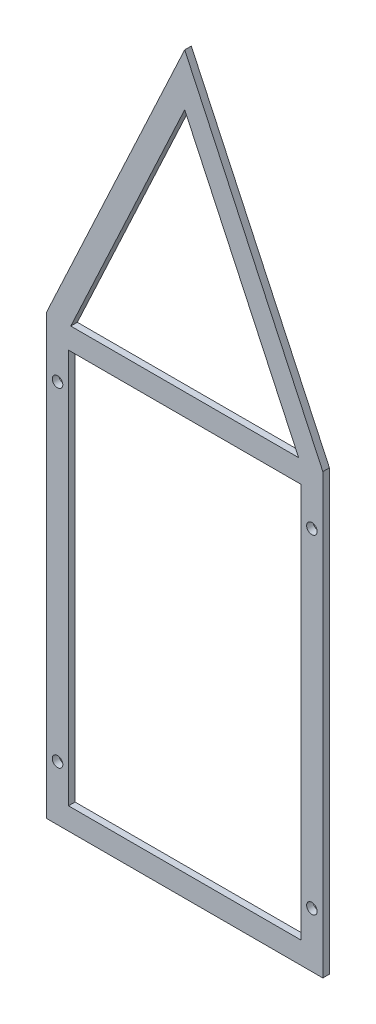
ISO-10303-21;
HEADER;
FILE_DESCRIPTION(('STEP AP214'),'2;1');
FILE_NAME('part.step','',(''),(''),'','','');
FILE_SCHEMA(('AUTOMOTIVE_DESIGN { 1 0 10303 214 1 1 1 1 }'));
ENDSEC;
DATA;
#1=APPLICATION_CONTEXT('core data for automotive mechanical design processes');
#2=APPLICATION_PROTOCOL_DEFINITION('international standard','automotive_design',2000,#1);
#3=PRODUCT_CONTEXT('',#1,'mechanical');
#4=PRODUCT('Part','Part','',(#3));
#5=PRODUCT_RELATED_PRODUCT_CATEGORY('part','',(#4));
#6=PRODUCT_DEFINITION_FORMATION('','',#4);
#7=PRODUCT_DEFINITION_CONTEXT('part definition',#1,'design');
#8=PRODUCT_DEFINITION('design','',#6,#7);
#9=PRODUCT_DEFINITION_SHAPE('','',#8);
#10=(LENGTH_UNIT() NAMED_UNIT(*) SI_UNIT(.MILLI.,.METRE.));
#11=(NAMED_UNIT(*) PLANE_ANGLE_UNIT() SI_UNIT($,.RADIAN.));
#12=(NAMED_UNIT(*) SI_UNIT($,.STERADIAN.) SOLID_ANGLE_UNIT());
#13=UNCERTAINTY_MEASURE_WITH_UNIT(LENGTH_MEASURE(1.E-05),#10,'distance_accuracy_value','');
#14=(GEOMETRIC_REPRESENTATION_CONTEXT(3) GLOBAL_UNCERTAINTY_ASSIGNED_CONTEXT((#13)) GLOBAL_UNIT_ASSIGNED_CONTEXT((#10,
#11,#12)) REPRESENTATION_CONTEXT('',''));
#15=CARTESIAN_POINT('',(0.,0.,0.));
#16=DIRECTION('',(0.,0.,1.));
#17=DIRECTION('',(1.,0.,0.));
#18=AXIS2_PLACEMENT_3D('',#15,#16,#17);
#19=CARTESIAN_POINT('',(0.,0.,1.5));
#20=DIRECTION('',(0.,0.,-1.));
#21=DIRECTION('',(-1.,0.,0.));
#22=AXIS2_PLACEMENT_3D('',#19,#20,#21);
#23=PLANE('',#22);
#24=DIRECTION('',(-1.,0.,0.));
#25=VECTOR('',#24,1.);
#26=CARTESIAN_POINT('',(-63.,100.,1.5));
#27=LINE('',#26,#25);
#28=CARTESIAN_POINT('',(51.9662208103751,100.,1.5));
#29=VERTEX_POINT('',#28);
#30=CARTESIAN_POINT('',(-51.966220810375,100.,1.5));
#31=VERTEX_POINT('',#30);
#32=EDGE_CURVE('E51',#29,#31,#27,.T.);
#33=ORIENTED_EDGE('',*,*,#32,.T.);
#34=DIRECTION('',(0.422618261740701,0.906307787036649,0.));
#35=VECTOR('',#34,1.);
#36=CARTESIAN_POINT('',(0.,211.441920160577,1.5));
#37=LINE('',#36,#35);
#38=CARTESIAN_POINT('',(0.,211.441920160577,1.5));
#39=VERTEX_POINT('',#38);
#40=EDGE_CURVE('E151',#31,#39,#37,.T.);
#41=ORIENTED_EDGE('',*,*,#40,.T.);
#42=DIRECTION('',(0.422618261740701,-0.906307787036649,0.));
#43=VECTOR('',#42,1.);
#44=CARTESIAN_POINT('',(51.9662208103751,100.,1.5));
#45=LINE('',#44,#43);
#46=EDGE_CURVE('E138',#39,#29,#45,.T.);
#47=ORIENTED_EDGE('',*,*,#46,.T.);
#48=EDGE_LOOP('',(#33,#41,#47));
#49=FACE_BOUND('',#48,.T.);
#50=DIRECTION('',(0.,1.,0.));
#51=VECTOR('',#50,1.);
#52=CARTESIAN_POINT('',(63.,-100.,1.5));
#53=LINE('',#52,#51);
#54=CARTESIAN_POINT('',(63.,-100.,1.5));
#55=VERTEX_POINT('',#54);
#56=CARTESIAN_POINT('',(63.,100.,1.5));
#57=VERTEX_POINT('',#56);
#58=EDGE_CURVE('E194',#55,#57,#53,.T.);
#59=ORIENTED_EDGE('',*,*,#58,.T.);
#60=DIRECTION('',(-0.422618261740701,0.906307787036649,0.));
#61=VECTOR('',#60,1.);
#62=CARTESIAN_POINT('',(0.,235.103935992102,1.5));
#63=LINE('',#62,#61);
#64=CARTESIAN_POINT('',(0.,235.103935992102,1.5));
#65=VERTEX_POINT('',#64);
#66=EDGE_CURVE('E147',#57,#65,#63,.T.);
#67=ORIENTED_EDGE('',*,*,#66,.T.);
#68=DIRECTION('',(-0.422618261740701,-0.906307787036649,0.));
#69=VECTOR('',#68,1.);
#70=CARTESIAN_POINT('',(-63.,100.,1.5));
#71=LINE('',#70,#69);
#72=CARTESIAN_POINT('',(-63.,100.,1.5));
#73=VERTEX_POINT('',#72);
#74=EDGE_CURVE('E144',#65,#73,#71,.T.);
#75=ORIENTED_EDGE('',*,*,#74,.T.);
#76=DIRECTION('',(0.,-1.,0.));
#77=VECTOR('',#76,1.);
#78=CARTESIAN_POINT('',(-63.,-100.,1.5));
#79=LINE('',#78,#77);
#80=CARTESIAN_POINT('',(-63.,-100.,1.5));
#81=VERTEX_POINT('',#80);
#82=EDGE_CURVE('E198',#73,#81,#79,.T.);
#83=ORIENTED_EDGE('',*,*,#82,.T.);
#84=DIRECTION('',(1.,0.,0.));
#85=VECTOR('',#84,1.);
#86=CARTESIAN_POINT('',(-63.,-100.,1.5));
#87=LINE('',#86,#85);
#88=EDGE_CURVE('E200',#81,#55,#87,.T.);
#89=ORIENTED_EDGE('',*,*,#88,.T.);
#90=EDGE_LOOP('',(#59,#67,#75,#83,#89));
#91=FACE_BOUND('',#90,.T.);
#92=DIRECTION('',(0.,-1.,0.));
#93=VECTOR('',#92,1.);
#94=CARTESIAN_POINT('',(-53.,-90.,1.5));
#95=LINE('',#94,#93);
#96=CARTESIAN_POINT('',(-53.,90.,1.5));
#97=VERTEX_POINT('',#96);
#98=CARTESIAN_POINT('',(-53.,-90.,1.5));
#99=VERTEX_POINT('',#98);
#100=EDGE_CURVE('E163',#97,#99,#95,.T.);
#101=ORIENTED_EDGE('',*,*,#100,.F.);
#102=DIRECTION('',(-1.,0.,0.));
#103=VECTOR('',#102,1.);
#104=CARTESIAN_POINT('',(-53.,90.,1.5));
#105=LINE('',#104,#103);
#106=CARTESIAN_POINT('',(53.,90.,1.5));
#107=VERTEX_POINT('',#106);
#108=EDGE_CURVE('E171',#107,#97,#105,.T.);
#109=ORIENTED_EDGE('',*,*,#108,.F.);
#110=DIRECTION('',(0.,1.,0.));
#111=VECTOR('',#110,1.);
#112=CARTESIAN_POINT('',(53.,-90.,1.5));
#113=LINE('',#112,#111);
#114=CARTESIAN_POINT('',(53.,-90.,1.5));
#115=VERTEX_POINT('',#114);
#116=EDGE_CURVE('E168',#115,#107,#113,.T.);
#117=ORIENTED_EDGE('',*,*,#116,.F.);
#118=DIRECTION('',(1.,0.,0.));
#119=VECTOR('',#118,1.);
#120=CARTESIAN_POINT('',(-53.,-90.,1.5));
#121=LINE('',#120,#119);
#122=EDGE_CURVE('E165',#99,#115,#121,.T.);
#123=ORIENTED_EDGE('',*,*,#122,.F.);
#124=EDGE_LOOP('',(#101,#109,#117,#123));
#125=FACE_BOUND('',#124,.T.);
#126=CARTESIAN_POINT('',(-58.,75.,1.5));
#127=DIRECTION('',(0.,0.,1.));
#128=DIRECTION('',(1.,0.,0.));
#129=AXIS2_PLACEMENT_3D('',#126,#127,#128);
#130=CIRCLE('',#129,2.4);
#131=CARTESIAN_POINT('',(-55.6,75.,1.5));
#132=VERTEX_POINT('',#131);
#133=EDGE_CURVE('E244',#132,#132,#130,.T.);
#134=ORIENTED_EDGE('',*,*,#133,.F.);
#135=EDGE_LOOP('',(#134));
#136=FACE_BOUND('',#135,.T.);
#137=CARTESIAN_POINT('',(58.,75.,1.5));
#138=DIRECTION('',(0.,0.,1.));
#139=DIRECTION('',(1.,0.,0.));
#140=AXIS2_PLACEMENT_3D('',#137,#138,#139);
#141=CIRCLE('',#140,2.4);
#142=CARTESIAN_POINT('',(60.4,75.,1.5));
#143=VERTEX_POINT('',#142);
#144=EDGE_CURVE('E250',#143,#143,#141,.T.);
#145=ORIENTED_EDGE('',*,*,#144,.F.);
#146=EDGE_LOOP('',(#145));
#147=FACE_BOUND('',#146,.T.);
#148=CARTESIAN_POINT('',(-58.,-75.,1.5));
#149=DIRECTION('',(0.,0.,1.));
#150=DIRECTION('',(1.,0.,0.));
#151=AXIS2_PLACEMENT_3D('',#148,#149,#150);
#152=CIRCLE('',#151,2.4);
#153=CARTESIAN_POINT('',(-55.6,-75.,1.5));
#154=VERTEX_POINT('',#153);
#155=EDGE_CURVE('E256',#154,#154,#152,.T.);
#156=ORIENTED_EDGE('',*,*,#155,.F.);
#157=EDGE_LOOP('',(#156));
#158=FACE_BOUND('',#157,.T.);
#159=CARTESIAN_POINT('',(58.,-75.,1.5));
#160=DIRECTION('',(0.,0.,1.));
#161=DIRECTION('',(1.,0.,0.));
#162=AXIS2_PLACEMENT_3D('',#159,#160,#161);
#163=CIRCLE('',#162,2.4);
#164=CARTESIAN_POINT('',(60.4,-75.,1.5));
#165=VERTEX_POINT('',#164);
#166=EDGE_CURVE('E262',#165,#165,#163,.T.);
#167=ORIENTED_EDGE('',*,*,#166,.F.);
#168=EDGE_LOOP('',(#167));
#169=FACE_BOUND('',#168,.T.);
#170=ADVANCED_FACE('F36',(#49,#91,#125,#136,#147,#158,#169),#23,.F.);
#171=CARTESIAN_POINT('',(0.,0.,-1.5));
#172=DIRECTION('',(0.,0.,-1.));
#173=DIRECTION('',(-1.,0.,0.));
#174=AXIS2_PLACEMENT_3D('',#171,#172,#173);
#175=PLANE('',#174);
#176=CARTESIAN_POINT('',(58.,-75.,-1.5));
#177=DIRECTION('',(0.,0.,-1.));
#178=DIRECTION('',(-1.,0.,0.));
#179=AXIS2_PLACEMENT_3D('',#176,#177,#178);
#180=CIRCLE('',#179,2.4);
#181=CARTESIAN_POINT('',(55.6,-75.,-1.5));
#182=VERTEX_POINT('',#181);
#183=EDGE_CURVE('E259',#182,#182,#180,.T.);
#184=ORIENTED_EDGE('',*,*,#183,.F.);
#185=EDGE_LOOP('',(#184));
#186=FACE_BOUND('',#185,.T.);
#187=CARTESIAN_POINT('',(-58.,-75.,-1.5));
#188=DIRECTION('',(0.,0.,-1.));
#189=DIRECTION('',(-1.,0.,0.));
#190=AXIS2_PLACEMENT_3D('',#187,#188,#189);
#191=CIRCLE('',#190,2.4);
#192=CARTESIAN_POINT('',(-60.4,-75.,-1.5));
#193=VERTEX_POINT('',#192);
#194=EDGE_CURVE('E253',#193,#193,#191,.T.);
#195=ORIENTED_EDGE('',*,*,#194,.F.);
#196=EDGE_LOOP('',(#195));
#197=FACE_BOUND('',#196,.T.);
#198=CARTESIAN_POINT('',(58.,75.,-1.5));
#199=DIRECTION('',(0.,0.,-1.));
#200=DIRECTION('',(-1.,0.,0.));
#201=AXIS2_PLACEMENT_3D('',#198,#199,#200);
#202=CIRCLE('',#201,2.4);
#203=CARTESIAN_POINT('',(55.6,75.,-1.5));
#204=VERTEX_POINT('',#203);
#205=EDGE_CURVE('E247',#204,#204,#202,.T.);
#206=ORIENTED_EDGE('',*,*,#205,.F.);
#207=EDGE_LOOP('',(#206));
#208=FACE_BOUND('',#207,.T.);
#209=CARTESIAN_POINT('',(-58.,75.,-1.5));
#210=DIRECTION('',(0.,0.,-1.));
#211=DIRECTION('',(-1.,0.,0.));
#212=AXIS2_PLACEMENT_3D('',#209,#210,#211);
#213=CIRCLE('',#212,2.4);
#214=CARTESIAN_POINT('',(-60.4,75.,-1.5));
#215=VERTEX_POINT('',#214);
#216=EDGE_CURVE('E241',#215,#215,#213,.T.);
#217=ORIENTED_EDGE('',*,*,#216,.F.);
#218=EDGE_LOOP('',(#217));
#219=FACE_BOUND('',#218,.T.);
#220=DIRECTION('',(0.422618261740701,0.906307787036649,0.));
#221=VECTOR('',#220,1.);
#222=CARTESIAN_POINT('',(0.,211.441920160577,-1.5));
#223=LINE('',#222,#221);
#224=CARTESIAN_POINT('',(-51.966220810375,100.,-1.5));
#225=VERTEX_POINT('',#224);
#226=CARTESIAN_POINT('',(0.,211.441920160577,-1.50000000000006));
#227=VERTEX_POINT('',#226);
#228=EDGE_CURVE('E129',#225,#227,#223,.T.);
#229=ORIENTED_EDGE('',*,*,#228,.F.);
#230=DIRECTION('',(-1.,0.,0.));
#231=VECTOR('',#230,1.);
#232=CARTESIAN_POINT('',(-63.,100.,-1.5));
#233=LINE('',#232,#231);
#234=CARTESIAN_POINT('',(51.9662208103751,100.,-1.5));
#235=VERTEX_POINT('',#234);
#236=EDGE_CURVE('E131',#235,#225,#233,.T.);
#237=ORIENTED_EDGE('',*,*,#236,.F.);
#238=DIRECTION('',(0.422618261740701,-0.906307787036649,0.));
#239=VECTOR('',#238,1.);
#240=CARTESIAN_POINT('',(51.9662208103751,100.,-1.5));
#241=LINE('',#240,#239);
#242=EDGE_CURVE('E124',#227,#235,#241,.T.);
#243=ORIENTED_EDGE('',*,*,#242,.F.);
#244=EDGE_LOOP('',(#229,#237,#243));
#245=FACE_BOUND('',#244,.T.);
#246=DIRECTION('',(0.,1.,0.));
#247=VECTOR('',#246,1.);
#248=CARTESIAN_POINT('',(63.,-100.,-1.5));
#249=LINE('',#248,#247);
#250=CARTESIAN_POINT('',(63.,-100.,-1.5));
#251=VERTEX_POINT('',#250);
#252=CARTESIAN_POINT('',(63.,100.,-1.5));
#253=VERTEX_POINT('',#252);
#254=EDGE_CURVE('E193',#251,#253,#249,.T.);
#255=ORIENTED_EDGE('',*,*,#254,.F.);
#256=DIRECTION('',(1.,0.,0.));
#257=VECTOR('',#256,1.);
#258=CARTESIAN_POINT('',(-63.,-100.,-1.5));
#259=LINE('',#258,#257);
#260=CARTESIAN_POINT('',(-63.,-100.,-1.5));
#261=VERTEX_POINT('',#260);
#262=EDGE_CURVE('E196',#261,#251,#259,.T.);
#263=ORIENTED_EDGE('',*,*,#262,.F.);
#264=DIRECTION('',(0.,-1.,0.));
#265=VECTOR('',#264,1.);
#266=CARTESIAN_POINT('',(-63.,-100.,-1.5));
#267=LINE('',#266,#265);
#268=CARTESIAN_POINT('',(-63.,100.,-1.5));
#269=VERTEX_POINT('',#268);
#270=EDGE_CURVE('E205',#269,#261,#267,.T.);
#271=ORIENTED_EDGE('',*,*,#270,.F.);
#272=DIRECTION('',(-0.422618261740701,-0.906307787036649,0.));
#273=VECTOR('',#272,1.);
#274=CARTESIAN_POINT('',(-63.,100.,-1.5));
#275=LINE('',#274,#273);
#276=CARTESIAN_POINT('',(0.,235.103935992102,-1.5));
#277=VERTEX_POINT('',#276);
#278=EDGE_CURVE('E153',#277,#269,#275,.T.);
#279=ORIENTED_EDGE('',*,*,#278,.F.);
#280=DIRECTION('',(-0.422618261740701,0.906307787036649,0.));
#281=VECTOR('',#280,1.);
#282=CARTESIAN_POINT('',(0.,235.103935992102,-1.5));
#283=LINE('',#282,#281);
#284=EDGE_CURVE('E156',#253,#277,#283,.T.);
#285=ORIENTED_EDGE('',*,*,#284,.F.);
#286=EDGE_LOOP('',(#255,#263,#271,#279,#285));
#287=FACE_BOUND('',#286,.T.);
#288=DIRECTION('',(-1.,0.,0.));
#289=VECTOR('',#288,1.);
#290=CARTESIAN_POINT('',(-53.,90.,-1.5));
#291=LINE('',#290,#289);
#292=CARTESIAN_POINT('',(53.,90.,-1.5));
#293=VERTEX_POINT('',#292);
#294=CARTESIAN_POINT('',(-53.,90.,-1.5));
#295=VERTEX_POINT('',#294);
#296=EDGE_CURVE('E166',#293,#295,#291,.T.);
#297=ORIENTED_EDGE('',*,*,#296,.T.);
#298=DIRECTION('',(0.,-1.,0.));
#299=VECTOR('',#298,1.);
#300=CARTESIAN_POINT('',(-53.,-90.,-1.5));
#301=LINE('',#300,#299);
#302=CARTESIAN_POINT('',(-53.,-90.,-1.5));
#303=VERTEX_POINT('',#302);
#304=EDGE_CURVE('E162',#295,#303,#301,.T.);
#305=ORIENTED_EDGE('',*,*,#304,.T.);
#306=DIRECTION('',(1.,0.,0.));
#307=VECTOR('',#306,1.);
#308=CARTESIAN_POINT('',(-53.,-90.,-1.5));
#309=LINE('',#308,#307);
#310=CARTESIAN_POINT('',(53.,-90.,-1.5));
#311=VERTEX_POINT('',#310);
#312=EDGE_CURVE('E176',#303,#311,#309,.T.);
#313=ORIENTED_EDGE('',*,*,#312,.T.);
#314=DIRECTION('',(0.,1.,0.));
#315=VECTOR('',#314,1.);
#316=CARTESIAN_POINT('',(53.,-90.,-1.5));
#317=LINE('',#316,#315);
#318=EDGE_CURVE('E179',#311,#293,#317,.T.);
#319=ORIENTED_EDGE('',*,*,#318,.T.);
#320=EDGE_LOOP('',(#297,#305,#313,#319));
#321=FACE_BOUND('',#320,.T.);
#322=ADVANCED_FACE('F126',(#186,#197,#208,#219,#245,#287,#321),#175,.T.);
#323=CARTESIAN_POINT('',(63.,-100.,1.5));
#324=DIRECTION('',(-1.,0.,0.));
#325=DIRECTION('',(0.,0.,1.));
#326=AXIS2_PLACEMENT_3D('',#323,#324,#325);
#327=PLANE('',#326);
#328=ORIENTED_EDGE('',*,*,#254,.T.);
#329=DIRECTION('',(0.,0.,-1.));
#330=VECTOR('',#329,1.);
#331=CARTESIAN_POINT('',(63.,100.,1.5));
#332=LINE('',#331,#330);
#333=EDGE_CURVE('E11',#57,#253,#332,.T.);
#334=ORIENTED_EDGE('',*,*,#333,.F.);
#335=ORIENTED_EDGE('',*,*,#58,.F.);
#336=DIRECTION('',(0.,0.,-1.));
#337=VECTOR('',#336,1.);
#338=CARTESIAN_POINT('',(63.,-100.,1.5));
#339=LINE('',#338,#337);
#340=EDGE_CURVE('E202',#55,#251,#339,.T.);
#341=ORIENTED_EDGE('',*,*,#340,.T.);
#342=EDGE_LOOP('',(#328,#334,#335,#341));
#343=FACE_BOUND('',#342,.T.);
#344=ADVANCED_FACE('F38',(#343),#327,.F.);
#345=CARTESIAN_POINT('',(-63.,100.,1.5));
#346=DIRECTION('',(0.,-1.,0.));
#347=DIRECTION('',(0.,0.,-1.));
#348=AXIS2_PLACEMENT_3D('',#345,#346,#347);
#349=PLANE('',#348);
#350=ORIENTED_EDGE('',*,*,#236,.T.);
#351=DIRECTION('',(0.,0.,1.));
#352=VECTOR('',#351,1.);
#353=CARTESIAN_POINT('',(-51.966220810375,100.,-186.240557324476));
#354=LINE('',#353,#352);
#355=EDGE_CURVE('E143',#225,#31,#354,.T.);
#356=ORIENTED_EDGE('',*,*,#355,.T.);
#357=ORIENTED_EDGE('',*,*,#32,.F.);
#358=DIRECTION('',(0.,0.,1.));
#359=VECTOR('',#358,1.);
#360=CARTESIAN_POINT('',(51.9662208103751,100.,-186.240557324476));
#361=LINE('',#360,#359);
#362=EDGE_CURVE('E55',#235,#29,#361,.T.);
#363=ORIENTED_EDGE('',*,*,#362,.F.);
#364=EDGE_LOOP('',(#350,#356,#357,#363));
#365=FACE_BOUND('',#364,.T.);
#366=ADVANCED_FACE('F285',(#365),#349,.F.);
#367=CARTESIAN_POINT('',(-63.,-100.,1.5));
#368=DIRECTION('',(1.,0.,0.));
#369=DIRECTION('',(0.,0.,-1.));
#370=AXIS2_PLACEMENT_3D('',#367,#368,#369);
#371=PLANE('',#370);
#372=ORIENTED_EDGE('',*,*,#270,.T.);
#373=DIRECTION('',(0.,0.,-1.));
#374=VECTOR('',#373,1.);
#375=CARTESIAN_POINT('',(-63.,-100.,1.5));
#376=LINE('',#375,#374);
#377=EDGE_CURVE('E210',#81,#261,#376,.T.);
#378=ORIENTED_EDGE('',*,*,#377,.F.);
#379=ORIENTED_EDGE('',*,*,#82,.F.);
#380=DIRECTION('',(0.,0.,-1.));
#381=VECTOR('',#380,1.);
#382=CARTESIAN_POINT('',(-63.,100.,1.5));
#383=LINE('',#382,#381);
#384=EDGE_CURVE('E44',#73,#269,#383,.T.);
#385=ORIENTED_EDGE('',*,*,#384,.T.);
#386=EDGE_LOOP('',(#372,#378,#379,#385));
#387=FACE_BOUND('',#386,.T.);
#388=ADVANCED_FACE('F216',(#387),#371,.F.);
#389=CARTESIAN_POINT('',(-63.,-100.,1.5));
#390=DIRECTION('',(0.,1.,0.));
#391=DIRECTION('',(0.,0.,1.));
#392=AXIS2_PLACEMENT_3D('',#389,#390,#391);
#393=PLANE('',#392);
#394=ORIENTED_EDGE('',*,*,#262,.T.);
#395=ORIENTED_EDGE('',*,*,#340,.F.);
#396=ORIENTED_EDGE('',*,*,#88,.F.);
#397=ORIENTED_EDGE('',*,*,#377,.T.);
#398=EDGE_LOOP('',(#394,#395,#396,#397));
#399=FACE_BOUND('',#398,.T.);
#400=ADVANCED_FACE('F227',(#399),#393,.F.);
#401=CARTESIAN_POINT('',(-53.,-90.,1.5));
#402=DIRECTION('',(1.,0.,0.));
#403=DIRECTION('',(0.,0.,-1.));
#404=AXIS2_PLACEMENT_3D('',#401,#402,#403);
#405=PLANE('',#404);
#406=ORIENTED_EDGE('',*,*,#304,.F.);
#407=DIRECTION('',(0.,0.,-1.));
#408=VECTOR('',#407,1.);
#409=CARTESIAN_POINT('',(-53.,90.,1.5));
#410=LINE('',#409,#408);
#411=EDGE_CURVE('E173',#97,#295,#410,.T.);
#412=ORIENTED_EDGE('',*,*,#411,.F.);
#413=ORIENTED_EDGE('',*,*,#100,.T.);
#414=DIRECTION('',(0.,0.,-1.));
#415=VECTOR('',#414,1.);
#416=CARTESIAN_POINT('',(-53.,-90.,1.5));
#417=LINE('',#416,#415);
#418=EDGE_CURVE('E190',#99,#303,#417,.T.);
#419=ORIENTED_EDGE('',*,*,#418,.T.);
#420=EDGE_LOOP('',(#406,#412,#413,#419));
#421=FACE_BOUND('',#420,.T.);
#422=ADVANCED_FACE('F279',(#421),#405,.T.);
#423=CARTESIAN_POINT('',(-53.,-90.,1.5));
#424=DIRECTION('',(0.,1.,0.));
#425=DIRECTION('',(0.,0.,1.));
#426=AXIS2_PLACEMENT_3D('',#423,#424,#425);
#427=PLANE('',#426);
#428=ORIENTED_EDGE('',*,*,#312,.F.);
#429=ORIENTED_EDGE('',*,*,#418,.F.);
#430=ORIENTED_EDGE('',*,*,#122,.T.);
#431=DIRECTION('',(0.,0.,-1.));
#432=VECTOR('',#431,1.);
#433=CARTESIAN_POINT('',(53.,-90.,1.5));
#434=LINE('',#433,#432);
#435=EDGE_CURVE('E188',#115,#311,#434,.T.);
#436=ORIENTED_EDGE('',*,*,#435,.T.);
#437=EDGE_LOOP('',(#428,#429,#430,#436));
#438=FACE_BOUND('',#437,.T.);
#439=ADVANCED_FACE('F398',(#438),#427,.T.);
#440=CARTESIAN_POINT('',(53.,-90.,1.5));
#441=DIRECTION('',(-1.,0.,0.));
#442=DIRECTION('',(0.,-1.,0.));
#443=AXIS2_PLACEMENT_3D('',#440,#441,#442);
#444=PLANE('',#443);
#445=ORIENTED_EDGE('',*,*,#318,.F.);
#446=ORIENTED_EDGE('',*,*,#435,.F.);
#447=ORIENTED_EDGE('',*,*,#116,.T.);
#448=DIRECTION('',(0.,0.,-1.));
#449=VECTOR('',#448,1.);
#450=CARTESIAN_POINT('',(53.,90.,1.5));
#451=LINE('',#450,#449);
#452=EDGE_CURVE('E186',#107,#293,#451,.T.);
#453=ORIENTED_EDGE('',*,*,#452,.T.);
#454=EDGE_LOOP('',(#445,#446,#447,#453));
#455=FACE_BOUND('',#454,.T.);
#456=ADVANCED_FACE('F389',(#455),#444,.T.);
#457=CARTESIAN_POINT('',(-53.,90.,1.5));
#458=DIRECTION('',(0.,-1.,0.));
#459=DIRECTION('',(0.,0.,-1.));
#460=AXIS2_PLACEMENT_3D('',#457,#458,#459);
#461=PLANE('',#460);
#462=ORIENTED_EDGE('',*,*,#296,.F.);
#463=ORIENTED_EDGE('',*,*,#452,.F.);
#464=ORIENTED_EDGE('',*,*,#108,.T.);
#465=ORIENTED_EDGE('',*,*,#411,.T.);
#466=EDGE_LOOP('',(#462,#463,#464,#465));
#467=FACE_BOUND('',#466,.T.);
#468=ADVANCED_FACE('F381',(#467),#461,.T.);
#469=CARTESIAN_POINT('',(0.,211.441920160577,-186.240557324476));
#470=DIRECTION('',(0.906307787036649,-0.422618261740701,0.));
#471=DIRECTION('',(0.422618261740701,0.906307787036649,0.));
#472=AXIS2_PLACEMENT_3D('',#469,#470,#471);
#473=PLANE('',#472);
#474=ORIENTED_EDGE('',*,*,#355,.F.);
#475=ORIENTED_EDGE('',*,*,#228,.T.);
#476=DIRECTION('',(0.,0.,1.));
#477=VECTOR('',#476,1.);
#478=CARTESIAN_POINT('',(0.,211.441920160577,-186.240557324476));
#479=LINE('',#478,#477);
#480=EDGE_CURVE('E133',#227,#39,#479,.T.);
#481=ORIENTED_EDGE('',*,*,#480,.T.);
#482=ORIENTED_EDGE('',*,*,#40,.F.);
#483=EDGE_LOOP('',(#474,#475,#481,#482));
#484=FACE_BOUND('',#483,.T.);
#485=ADVANCED_FACE('F142',(#484),#473,.T.);
#486=CARTESIAN_POINT('',(51.9662208103751,100.,-186.240557324476));
#487=DIRECTION('',(-0.906307787036649,-0.422618261740701,0.));
#488=DIRECTION('',(0.422618261740701,-0.906307787036649,0.));
#489=AXIS2_PLACEMENT_3D('',#486,#487,#488);
#490=PLANE('',#489);
#491=ORIENTED_EDGE('',*,*,#480,.F.);
#492=ORIENTED_EDGE('',*,*,#242,.T.);
#493=ORIENTED_EDGE('',*,*,#362,.T.);
#494=ORIENTED_EDGE('',*,*,#46,.F.);
#495=EDGE_LOOP('',(#491,#492,#493,#494));
#496=FACE_BOUND('',#495,.T.);
#497=ADVANCED_FACE('F136',(#496),#490,.T.);
#498=CARTESIAN_POINT('',(0.,235.103935992102,-186.240557324476));
#499=DIRECTION('',(0.906307787036649,0.422618261740701,0.));
#500=DIRECTION('',(-0.422618261740701,0.906307787036649,0.));
#501=AXIS2_PLACEMENT_3D('',#498,#499,#500);
#502=PLANE('',#501);
#503=ORIENTED_EDGE('',*,*,#333,.T.);
#504=ORIENTED_EDGE('',*,*,#284,.T.);
#505=DIRECTION('',(0.,0.,1.));
#506=VECTOR('',#505,1.);
#507=CARTESIAN_POINT('',(0.,235.103935992102,-186.240557324476));
#508=LINE('',#507,#506);
#509=EDGE_CURVE('E155',#277,#65,#508,.T.);
#510=ORIENTED_EDGE('',*,*,#509,.T.);
#511=ORIENTED_EDGE('',*,*,#66,.F.);
#512=EDGE_LOOP('',(#503,#504,#510,#511));
#513=FACE_BOUND('',#512,.T.);
#514=ADVANCED_FACE('F238',(#513),#502,.T.);
#515=CARTESIAN_POINT('',(-63.,100.,-186.240557324476));
#516=DIRECTION('',(-0.906307787036649,0.422618261740701,0.));
#517=DIRECTION('',(-0.422618261740701,-0.906307787036649,0.));
#518=AXIS2_PLACEMENT_3D('',#515,#516,#517);
#519=PLANE('',#518);
#520=ORIENTED_EDGE('',*,*,#509,.F.);
#521=ORIENTED_EDGE('',*,*,#278,.T.);
#522=ORIENTED_EDGE('',*,*,#384,.F.);
#523=ORIENTED_EDGE('',*,*,#74,.F.);
#524=EDGE_LOOP('',(#520,#521,#522,#523));
#525=FACE_BOUND('',#524,.T.);
#526=ADVANCED_FACE('F236',(#525),#519,.T.);
#527=CARTESIAN_POINT('',(-58.,75.,1.5));
#528=DIRECTION('',(0.,0.,1.));
#529=DIRECTION('',(1.,0.,0.));
#530=AXIS2_PLACEMENT_3D('',#527,#528,#529);
#531=CYLINDRICAL_SURFACE('',#530,2.4);
#532=ORIENTED_EDGE('',*,*,#133,.T.);
#533=EDGE_LOOP('',(#532));
#534=FACE_BOUND('',#533,.T.);
#535=ORIENTED_EDGE('',*,*,#216,.T.);
#536=EDGE_LOOP('',(#535));
#537=FACE_BOUND('',#536,.T.);
#538=ADVANCED_FACE('F311',(#534,#537),#531,.F.);
#539=CARTESIAN_POINT('',(58.,75.,1.5));
#540=DIRECTION('',(0.,0.,1.));
#541=DIRECTION('',(1.,0.,0.));
#542=AXIS2_PLACEMENT_3D('',#539,#540,#541);
#543=CYLINDRICAL_SURFACE('',#542,2.4);
#544=ORIENTED_EDGE('',*,*,#144,.T.);
#545=EDGE_LOOP('',(#544));
#546=FACE_BOUND('',#545,.T.);
#547=ORIENTED_EDGE('',*,*,#205,.T.);
#548=EDGE_LOOP('',(#547));
#549=FACE_BOUND('',#548,.T.);
#550=ADVANCED_FACE('F305',(#546,#549),#543,.F.);
#551=CARTESIAN_POINT('',(-58.,-75.,1.5));
#552=DIRECTION('',(0.,0.,1.));
#553=DIRECTION('',(1.,0.,0.));
#554=AXIS2_PLACEMENT_3D('',#551,#552,#553);
#555=CYLINDRICAL_SURFACE('',#554,2.4);
#556=ORIENTED_EDGE('',*,*,#155,.T.);
#557=EDGE_LOOP('',(#556));
#558=FACE_BOUND('',#557,.T.);
#559=ORIENTED_EDGE('',*,*,#194,.T.);
#560=EDGE_LOOP('',(#559));
#561=FACE_BOUND('',#560,.T.);
#562=ADVANCED_FACE('F310',(#558,#561),#555,.F.);
#563=CARTESIAN_POINT('',(58.,-75.,1.5));
#564=DIRECTION('',(0.,0.,1.));
#565=DIRECTION('',(1.,0.,0.));
#566=AXIS2_PLACEMENT_3D('',#563,#564,#565);
#567=CYLINDRICAL_SURFACE('',#566,2.4);
#568=ORIENTED_EDGE('',*,*,#166,.T.);
#569=EDGE_LOOP('',(#568));
#570=FACE_BOUND('',#569,.T.);
#571=ORIENTED_EDGE('',*,*,#183,.T.);
#572=EDGE_LOOP('',(#571));
#573=FACE_BOUND('',#572,.T.);
#574=ADVANCED_FACE('F266',(#570,#573),#567,.F.);
#575=CLOSED_SHELL('',(#170,#322,#344,#366,#388,#400,#422,#439,#456,#468,#485,#497,#514,#526,
#538,#550,#562,#574));
#576=MANIFOLD_SOLID_BREP('B2',#575);
#577=ADVANCED_BREP_SHAPE_REPRESENTATION('',(#18,#576),#14);
#578=SHAPE_DEFINITION_REPRESENTATION(#9,#577);
ENDSEC;
END-ISO-10303-21;
